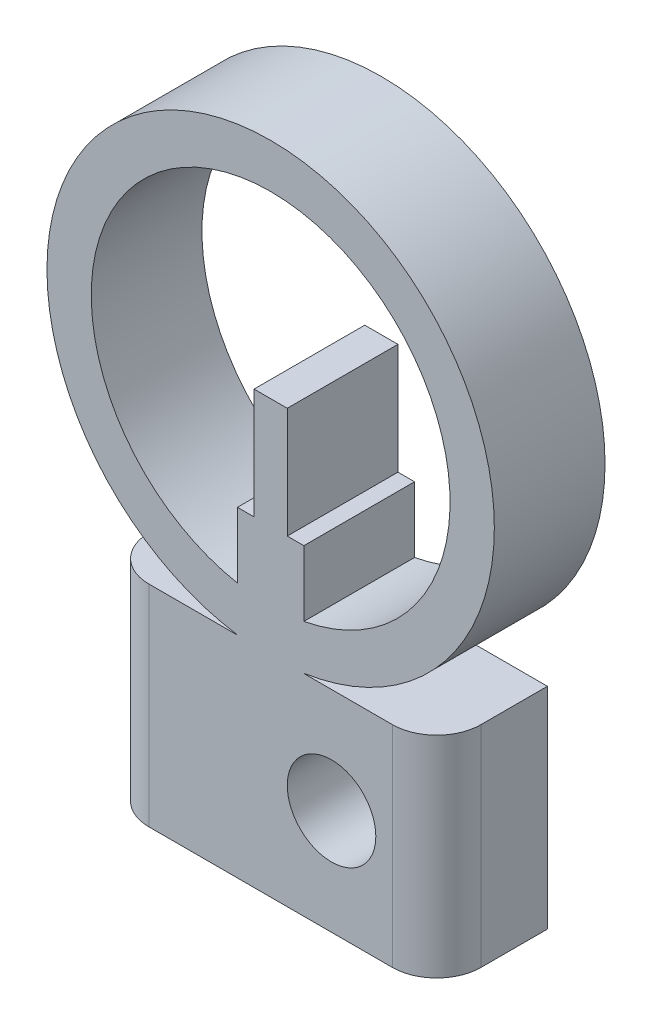
ISO-10303-21;
HEADER;
FILE_DESCRIPTION(('STEP AP214'),'2;1');
FILE_NAME('part.step','',(''),(''),'','','');
FILE_SCHEMA(('AUTOMOTIVE_DESIGN { 1 0 10303 214 1 1 1 1 }'));
ENDSEC;
DATA;
#1=APPLICATION_CONTEXT('core data for automotive mechanical design processes');
#2=APPLICATION_PROTOCOL_DEFINITION('international standard','automotive_design',2000,#1);
#3=PRODUCT_CONTEXT('',#1,'mechanical');
#4=PRODUCT('Part','Part','',(#3));
#5=PRODUCT_RELATED_PRODUCT_CATEGORY('part','',(#4));
#6=PRODUCT_DEFINITION_FORMATION('','',#4);
#7=PRODUCT_DEFINITION_CONTEXT('part definition',#1,'design');
#8=PRODUCT_DEFINITION('design','',#6,#7);
#9=PRODUCT_DEFINITION_SHAPE('','',#8);
#10=(LENGTH_UNIT() NAMED_UNIT(*) SI_UNIT(.MILLI.,.METRE.));
#11=(NAMED_UNIT(*) PLANE_ANGLE_UNIT() SI_UNIT($,.RADIAN.));
#12=(NAMED_UNIT(*) SI_UNIT($,.STERADIAN.) SOLID_ANGLE_UNIT());
#13=UNCERTAINTY_MEASURE_WITH_UNIT(LENGTH_MEASURE(1.E-05),#10,'distance_accuracy_value','');
#14=(GEOMETRIC_REPRESENTATION_CONTEXT(3) GLOBAL_UNCERTAINTY_ASSIGNED_CONTEXT((#13)) GLOBAL_UNIT_ASSIGNED_CONTEXT((#10,
#11,#12)) REPRESENTATION_CONTEXT('',''));
#15=CARTESIAN_POINT('',(0.,0.,0.));
#16=DIRECTION('',(0.,0.,1.));
#17=DIRECTION('',(1.,0.,0.));
#18=AXIS2_PLACEMENT_3D('',#15,#16,#17);
#19=CARTESIAN_POINT('',(-1.5,9.75,-5.));
#20=DIRECTION('',(1.,0.,0.));
#21=DIRECTION('',(0.,1.,0.));
#22=AXIS2_PLACEMENT_3D('',#19,#20,#21);
#23=PLANE('',#22);
#24=DIRECTION('',(0.,0.,1.));
#25=VECTOR('',#24,1.);
#26=CARTESIAN_POINT('',(-1.5,6.78672201259756,-5.));
#27=LINE('',#26,#25);
#28=CARTESIAN_POINT('',(-1.5,6.78672201259756,0.));
#29=VERTEX_POINT('',#28);
#30=CARTESIAN_POINT('',(-1.5,6.78672201259756,-5.));
#31=VERTEX_POINT('',#30);
#32=EDGE_CURVE('E165',#29,#31,#27,.F.);
#33=ORIENTED_EDGE('',*,*,#32,.F.);
#34=DIRECTION('',(0.,-1.,0.));
#35=VECTOR('',#34,1.);
#36=CARTESIAN_POINT('',(-1.5,9.75,0.));
#37=LINE('',#36,#35);
#38=CARTESIAN_POINT('',(-1.5,9.75,0.));
#39=VERTEX_POINT('',#38);
#40=EDGE_CURVE('E270',#39,#29,#37,.T.);
#41=ORIENTED_EDGE('',*,*,#40,.F.);
#42=DIRECTION('',(0.,0.,1.));
#43=VECTOR('',#42,1.);
#44=CARTESIAN_POINT('',(-1.5,9.75,-5.));
#45=LINE('',#44,#43);
#46=CARTESIAN_POINT('',(-1.5,9.75,-5.));
#47=VERTEX_POINT('',#46);
#48=EDGE_CURVE('E168',#47,#39,#45,.T.);
#49=ORIENTED_EDGE('',*,*,#48,.F.);
#50=DIRECTION('',(0.,-1.,0.));
#51=VECTOR('',#50,1.);
#52=CARTESIAN_POINT('',(-1.5,9.75,-5.));
#53=LINE('',#52,#51);
#54=EDGE_CURVE('E162',#47,#31,#53,.T.);
#55=ORIENTED_EDGE('',*,*,#54,.T.);
#56=EDGE_LOOP('',(#33,#41,#49,#55));
#57=FACE_BOUND('',#56,.T.);
#58=ADVANCED_FACE('F39',(#57),#23,.F.);
#59=CARTESIAN_POINT('',(1.5,9.75,-5.));
#60=DIRECTION('',(-1.,0.,0.));
#61=DIRECTION('',(0.,-1.,0.));
#62=AXIS2_PLACEMENT_3D('',#59,#60,#61);
#63=PLANE('',#62);
#64=DIRECTION('',(0.,0.,1.));
#65=VECTOR('',#64,1.);
#66=CARTESIAN_POINT('',(1.5,6.78672201259756,-5.));
#67=LINE('',#66,#65);
#68=CARTESIAN_POINT('',(1.5,6.78672201259756,-5.));
#69=VERTEX_POINT('',#68);
#70=CARTESIAN_POINT('',(1.5,6.78672201259756,0.));
#71=VERTEX_POINT('',#70);
#72=EDGE_CURVE('E48',#69,#71,#67,.T.);
#73=ORIENTED_EDGE('',*,*,#72,.F.);
#74=DIRECTION('',(0.,-1.,0.));
#75=VECTOR('',#74,1.);
#76=CARTESIAN_POINT('',(1.5,9.75,-5.));
#77=LINE('',#76,#75);
#78=CARTESIAN_POINT('',(1.5,9.75,-5.));
#79=VERTEX_POINT('',#78);
#80=EDGE_CURVE('E191',#79,#69,#77,.T.);
#81=ORIENTED_EDGE('',*,*,#80,.F.);
#82=DIRECTION('',(0.,0.,-1.));
#83=VECTOR('',#82,1.);
#84=CARTESIAN_POINT('',(1.5,9.75,-5.));
#85=LINE('',#84,#83);
#86=CARTESIAN_POINT('',(1.5,9.75,0.));
#87=VERTEX_POINT('',#86);
#88=EDGE_CURVE('E251',#87,#79,#85,.T.);
#89=ORIENTED_EDGE('',*,*,#88,.F.);
#90=DIRECTION('',(0.,-1.,0.));
#91=VECTOR('',#90,1.);
#92=CARTESIAN_POINT('',(1.5,9.75,0.));
#93=LINE('',#92,#91);
#94=EDGE_CURVE('E267',#87,#71,#93,.T.);
#95=ORIENTED_EDGE('',*,*,#94,.T.);
#96=EDGE_LOOP('',(#73,#81,#89,#95));
#97=FACE_BOUND('',#96,.T.);
#98=ADVANCED_FACE('F383',(#97),#63,.F.);
#99=CARTESIAN_POINT('',(0.,9.75,0.));
#100=DIRECTION('',(0.,-1.,0.));
#101=DIRECTION('',(0.,0.,-1.));
#102=AXIS2_PLACEMENT_3D('',#99,#100,#101);
#103=PLANE('',#102);
#104=DIRECTION('',(0.,0.,1.));
#105=VECTOR('',#104,1.);
#106=CARTESIAN_POINT('',(-0.750000000000001,9.75,-5.));
#107=LINE('',#106,#105);
#108=CARTESIAN_POINT('',(-0.750000000000001,9.75,-5.));
#109=VERTEX_POINT('',#108);
#110=CARTESIAN_POINT('',(-0.750000000000001,9.75,0.));
#111=VERTEX_POINT('',#110);
#112=EDGE_CURVE('E219',#109,#111,#107,.T.);
#113=ORIENTED_EDGE('',*,*,#112,.F.);
#114=DIRECTION('',(-1.,0.,0.));
#115=VECTOR('',#114,1.);
#116=CARTESIAN_POINT('',(1.5,9.75,-5.));
#117=LINE('',#116,#115);
#118=EDGE_CURVE('E254',#109,#47,#117,.T.);
#119=ORIENTED_EDGE('',*,*,#118,.T.);
#120=ORIENTED_EDGE('',*,*,#48,.T.);
#121=DIRECTION('',(1.,0.,0.));
#122=VECTOR('',#121,1.);
#123=CARTESIAN_POINT('',(1.5,9.75,0.));
#124=LINE('',#123,#122);
#125=EDGE_CURVE('E247',#39,#111,#124,.T.);
#126=ORIENTED_EDGE('',*,*,#125,.T.);
#127=EDGE_LOOP('',(#113,#119,#120,#126));
#128=FACE_BOUND('',#127,.T.);
#129=ADVANCED_FACE('F356',(#128),#103,.F.);
#130=CARTESIAN_POINT('',(7.5,4.75,-5.));
#131=DIRECTION('',(0.,1.,0.));
#132=DIRECTION('',(-1.,0.,0.));
#133=AXIS2_PLACEMENT_3D('',#130,#131,#132);
#134=PLANE('',#133);
#135=DIRECTION('',(0.,0.,1.));
#136=VECTOR('',#135,1.);
#137=CARTESIAN_POINT('',(-7.5,4.75,-5.));
#138=LINE('',#137,#136);
#139=CARTESIAN_POINT('',(-7.5,4.75,-5.));
#140=VERTEX_POINT('',#139);
#141=CARTESIAN_POINT('',(-7.5,4.75,-2.));
#142=VERTEX_POINT('',#141);
#143=EDGE_CURVE('E310',#140,#142,#138,.T.);
#144=ORIENTED_EDGE('',*,*,#143,.T.);
#145=CARTESIAN_POINT('',(-5.5,4.75,-2.));
#146=DIRECTION('',(0.,1.,0.));
#147=DIRECTION('',(-1.,0.,0.));
#148=AXIS2_PLACEMENT_3D('',#145,#146,#147);
#149=CIRCLE('',#148,2.);
#150=CARTESIAN_POINT('',(-5.5,4.75,0.));
#151=VERTEX_POINT('',#150);
#152=EDGE_CURVE('E337',#142,#151,#149,.T.);
#153=ORIENTED_EDGE('',*,*,#152,.T.);
#154=DIRECTION('',(-1.,0.,0.));
#155=VECTOR('',#154,1.);
#156=CARTESIAN_POINT('',(7.5,4.75,0.));
#157=LINE('',#156,#155);
#158=CARTESIAN_POINT('',(-1.5,4.75,0.));
#159=VERTEX_POINT('',#158);
#160=EDGE_CURVE('E299',#159,#151,#157,.T.);
#161=ORIENTED_EDGE('',*,*,#160,.F.);
#162=DIRECTION('',(0.,0.,1.));
#163=VECTOR('',#162,1.);
#164=CARTESIAN_POINT('',(-1.5,4.75,-5.));
#165=LINE('',#164,#163);
#166=CARTESIAN_POINT('',(-1.5,4.75,-5.));
#167=VERTEX_POINT('',#166);
#168=EDGE_CURVE('E242',#167,#159,#165,.T.);
#169=ORIENTED_EDGE('',*,*,#168,.F.);
#170=DIRECTION('',(-1.,0.,0.));
#171=VECTOR('',#170,1.);
#172=CARTESIAN_POINT('',(7.5,4.75,-5.));
#173=LINE('',#172,#171);
#174=EDGE_CURVE('E286',#167,#140,#173,.T.);
#175=ORIENTED_EDGE('',*,*,#174,.T.);
#176=EDGE_LOOP('',(#144,#153,#161,#169,#175));
#177=FACE_BOUND('',#176,.T.);
#178=ADVANCED_FACE('F419',(#177),#134,.T.);
#179=CARTESIAN_POINT('',(7.5,-4.75,-5.));
#180=DIRECTION('',(0.,1.,0.));
#181=DIRECTION('',(-1.,0.,0.));
#182=AXIS2_PLACEMENT_3D('',#179,#180,#181);
#183=PLANE('',#182);
#184=DIRECTION('',(-1.,0.,0.));
#185=VECTOR('',#184,1.);
#186=CARTESIAN_POINT('',(7.5,-4.75,0.));
#187=LINE('',#186,#185);
#188=CARTESIAN_POINT('',(5.5,-4.75,0.));
#189=VERTEX_POINT('',#188);
#190=CARTESIAN_POINT('',(-5.5,-4.75,0.));
#191=VERTEX_POINT('',#190);
#192=EDGE_CURVE('E295',#189,#191,#187,.T.);
#193=ORIENTED_EDGE('',*,*,#192,.T.);
#194=CARTESIAN_POINT('',(-5.5,-4.75,-2.));
#195=DIRECTION('',(0.,1.,0.));
#196=DIRECTION('',(-1.,0.,0.));
#197=AXIS2_PLACEMENT_3D('',#194,#195,#196);
#198=CIRCLE('',#197,2.);
#199=CARTESIAN_POINT('',(-7.5,-4.75,-2.));
#200=VERTEX_POINT('',#199);
#201=EDGE_CURVE('E331',#191,#200,#198,.F.);
#202=ORIENTED_EDGE('',*,*,#201,.T.);
#203=DIRECTION('',(0.,0.,1.));
#204=VECTOR('',#203,1.);
#205=CARTESIAN_POINT('',(-7.5,-4.75,-5.));
#206=LINE('',#205,#204);
#207=CARTESIAN_POINT('',(-7.5,-4.75,-5.));
#208=VERTEX_POINT('',#207);
#209=EDGE_CURVE('E314',#208,#200,#206,.T.);
#210=ORIENTED_EDGE('',*,*,#209,.F.);
#211=DIRECTION('',(-1.,0.,0.));
#212=VECTOR('',#211,1.);
#213=CARTESIAN_POINT('',(7.5,-4.75,-5.));
#214=LINE('',#213,#212);
#215=CARTESIAN_POINT('',(7.5,-4.75,-5.));
#216=VERTEX_POINT('',#215);
#217=EDGE_CURVE('E278',#216,#208,#214,.T.);
#218=ORIENTED_EDGE('',*,*,#217,.F.);
#219=DIRECTION('',(0.,0.,1.));
#220=VECTOR('',#219,1.);
#221=CARTESIAN_POINT('',(7.5,-4.75,-5.));
#222=LINE('',#221,#220);
#223=CARTESIAN_POINT('',(7.5,-4.75,-2.));
#224=VERTEX_POINT('',#223);
#225=EDGE_CURVE('E294',#216,#224,#222,.T.);
#226=ORIENTED_EDGE('',*,*,#225,.T.);
#227=CARTESIAN_POINT('',(5.5,-4.75,-2.));
#228=DIRECTION('',(0.,1.,0.));
#229=DIRECTION('',(-1.,0.,0.));
#230=AXIS2_PLACEMENT_3D('',#227,#228,#229);
#231=CIRCLE('',#230,2.);
#232=EDGE_CURVE('E328',#224,#189,#231,.F.);
#233=ORIENTED_EDGE('',*,*,#232,.T.);
#234=EDGE_LOOP('',(#193,#202,#210,#218,#226,#233));
#235=FACE_BOUND('',#234,.T.);
#236=ADVANCED_FACE('F422',(#235),#183,.F.);
#237=CARTESIAN_POINT('',(-7.5,4.75,-5.));
#238=DIRECTION('',(-1.,0.,0.));
#239=DIRECTION('',(0.,-1.,0.));
#240=AXIS2_PLACEMENT_3D('',#237,#238,#239);
#241=PLANE('',#240);
#242=ORIENTED_EDGE('',*,*,#209,.T.);
#243=DIRECTION('',(0.,-1.,0.));
#244=VECTOR('',#243,1.);
#245=CARTESIAN_POINT('',(-7.5,4.75,-2.));
#246=LINE('',#245,#244);
#247=EDGE_CURVE('E334',#200,#142,#246,.F.);
#248=ORIENTED_EDGE('',*,*,#247,.T.);
#249=ORIENTED_EDGE('',*,*,#143,.F.);
#250=DIRECTION('',(0.,-1.,0.));
#251=VECTOR('',#250,1.);
#252=CARTESIAN_POINT('',(-7.5,4.75,-5.));
#253=LINE('',#252,#251);
#254=EDGE_CURVE('E281',#140,#208,#253,.T.);
#255=ORIENTED_EDGE('',*,*,#254,.T.);
#256=EDGE_LOOP('',(#242,#248,#249,#255));
#257=FACE_BOUND('',#256,.T.);
#258=ADVANCED_FACE('F417',(#257),#241,.T.);
#259=CARTESIAN_POINT('',(5.5,4.75,0.));
#260=VERTEX_POINT('',#259);
#261=CARTESIAN_POINT('',(1.5,4.75,0.));
#262=VERTEX_POINT('',#261);
#263=EDGE_CURVE('E282',#260,#262,#157,.T.);
#264=ORIENTED_EDGE('',*,*,#263,.F.);
#265=CARTESIAN_POINT('',(5.5,4.75,-2.));
#266=DIRECTION('',(0.,1.,0.));
#267=DIRECTION('',(-1.,0.,0.));
#268=AXIS2_PLACEMENT_3D('',#265,#266,#267);
#269=CIRCLE('',#268,2.);
#270=CARTESIAN_POINT('',(7.5,4.75,-2.));
#271=VERTEX_POINT('',#270);
#272=EDGE_CURVE('E344',#260,#271,#269,.T.);
#273=ORIENTED_EDGE('',*,*,#272,.T.);
#274=DIRECTION('',(0.,0.,1.));
#275=VECTOR('',#274,1.);
#276=CARTESIAN_POINT('',(7.5,4.75,-5.));
#277=LINE('',#276,#275);
#278=CARTESIAN_POINT('',(7.5,4.75,-5.));
#279=VERTEX_POINT('',#278);
#280=EDGE_CURVE('E306',#279,#271,#277,.T.);
#281=ORIENTED_EDGE('',*,*,#280,.F.);
#282=CARTESIAN_POINT('',(1.5,4.75,-5.));
#283=VERTEX_POINT('',#282);
#284=EDGE_CURVE('E287',#279,#283,#173,.T.);
#285=ORIENTED_EDGE('',*,*,#284,.T.);
#286=DIRECTION('',(0.,0.,-1.));
#287=VECTOR('',#286,1.);
#288=CARTESIAN_POINT('',(1.5,4.75,-5.));
#289=LINE('',#288,#287);
#290=EDGE_CURVE('E246',#262,#283,#289,.T.);
#291=ORIENTED_EDGE('',*,*,#290,.F.);
#292=EDGE_LOOP('',(#264,#273,#281,#285,#291));
#293=FACE_BOUND('',#292,.T.);
#294=ADVANCED_FACE('F413',(#293),#134,.T.);
#295=CARTESIAN_POINT('',(7.5,4.75,-5.));
#296=DIRECTION('',(-1.,0.,0.));
#297=DIRECTION('',(0.,0.,1.));
#298=AXIS2_PLACEMENT_3D('',#295,#296,#297);
#299=PLANE('',#298);
#300=ORIENTED_EDGE('',*,*,#280,.T.);
#301=DIRECTION('',(0.,-1.,0.));
#302=VECTOR('',#301,1.);
#303=CARTESIAN_POINT('',(7.5,-4.75,-2.));
#304=LINE('',#303,#302);
#305=EDGE_CURVE('E340',#271,#224,#304,.T.);
#306=ORIENTED_EDGE('',*,*,#305,.T.);
#307=ORIENTED_EDGE('',*,*,#225,.F.);
#308=DIRECTION('',(0.,-1.,0.));
#309=VECTOR('',#308,1.);
#310=CARTESIAN_POINT('',(7.5,4.75,-5.));
#311=LINE('',#310,#309);
#312=EDGE_CURVE('E291',#279,#216,#311,.T.);
#313=ORIENTED_EDGE('',*,*,#312,.F.);
#314=EDGE_LOOP('',(#300,#306,#307,#313));
#315=FACE_BOUND('',#314,.T.);
#316=ADVANCED_FACE('F408',(#315),#299,.F.);
#317=CARTESIAN_POINT('',(0.,0.,-5.));
#318=DIRECTION('',(0.,0.,1.));
#319=DIRECTION('',(1.,0.,0.));
#320=AXIS2_PLACEMENT_3D('',#317,#318,#319);
#321=PLANE('',#320);
#322=CARTESIAN_POINT('',(2.75,0.,-5.));
#323=DIRECTION('',(0.,0.,1.));
#324=DIRECTION('',(1.,0.,0.));
#325=AXIS2_PLACEMENT_3D('',#322,#323,#324);
#326=CIRCLE('',#325,2.);
#327=CARTESIAN_POINT('',(4.75,0.,-5.));
#328=VERTEX_POINT('',#327);
#329=EDGE_CURVE('E273',#328,#328,#326,.T.);
#330=ORIENTED_EDGE('',*,*,#329,.T.);
#331=EDGE_LOOP('',(#330));
#332=FACE_BOUND('',#331,.T.);
#333=CARTESIAN_POINT('',(-1.5,4.75864990999099,-5.));
#334=VERTEX_POINT('',#333);
#335=EDGE_CURVE('E174',#334,#167,#53,.T.);
#336=ORIENTED_EDGE('',*,*,#335,.F.);
#337=CARTESIAN_POINT('',(0.,14.75,-5.));
#338=DIRECTION('',(0.,0.,1.));
#339=DIRECTION('',(1.,0.,0.));
#340=AXIS2_PLACEMENT_3D('',#337,#338,#339);
#341=CIRCLE('',#340,10.1033200791187);
#342=CARTESIAN_POINT('',(1.5,4.75864990999099,-5.));
#343=VERTEX_POINT('',#342);
#344=EDGE_CURVE('E185',#343,#334,#341,.T.);
#345=ORIENTED_EDGE('',*,*,#344,.F.);
#346=EDGE_CURVE('E173',#343,#283,#77,.T.);
#347=ORIENTED_EDGE('',*,*,#346,.T.);
#348=ORIENTED_EDGE('',*,*,#284,.F.);
#349=ORIENTED_EDGE('',*,*,#312,.T.);
#350=ORIENTED_EDGE('',*,*,#217,.T.);
#351=ORIENTED_EDGE('',*,*,#254,.F.);
#352=ORIENTED_EDGE('',*,*,#174,.F.);
#353=EDGE_LOOP('',(#336,#345,#347,#348,#349,#350,#351,#352));
#354=FACE_BOUND('',#353,.T.);
#355=ORIENTED_EDGE('',*,*,#80,.T.);
#356=CARTESIAN_POINT('',(0.,14.75,-5.));
#357=DIRECTION('',(0.,0.,1.));
#358=DIRECTION('',(1.,0.,0.));
#359=AXIS2_PLACEMENT_3D('',#356,#357,#358);
#360=CIRCLE('',#359,8.1033200791187);
#361=EDGE_CURVE('E181',#69,#31,#360,.T.);
#362=ORIENTED_EDGE('',*,*,#361,.T.);
#363=ORIENTED_EDGE('',*,*,#54,.F.);
#364=ORIENTED_EDGE('',*,*,#118,.F.);
#365=DIRECTION('',(0.,1.,0.));
#366=VECTOR('',#365,1.);
#367=CARTESIAN_POINT('',(-0.750000000000001,9.75,-5.));
#368=LINE('',#367,#366);
#369=CARTESIAN_POINT('',(-0.750000000000001,14.75,-5.));
#370=VERTEX_POINT('',#369);
#371=EDGE_CURVE('E207',#109,#370,#368,.T.);
#372=ORIENTED_EDGE('',*,*,#371,.T.);
#373=DIRECTION('',(-1.,0.,0.));
#374=VECTOR('',#373,1.);
#375=CARTESIAN_POINT('',(0.749999999999999,14.75,-5.));
#376=LINE('',#375,#374);
#377=CARTESIAN_POINT('',(0.749999999999999,14.75,-5.));
#378=VERTEX_POINT('',#377);
#379=EDGE_CURVE('E210',#378,#370,#376,.T.);
#380=ORIENTED_EDGE('',*,*,#379,.F.);
#381=DIRECTION('',(0.,1.,0.));
#382=VECTOR('',#381,1.);
#383=CARTESIAN_POINT('',(0.749999999999999,9.75,-5.));
#384=LINE('',#383,#382);
#385=CARTESIAN_POINT('',(0.749999999999999,9.75,-5.));
#386=VERTEX_POINT('',#385);
#387=EDGE_CURVE('E215',#386,#378,#384,.T.);
#388=ORIENTED_EDGE('',*,*,#387,.F.);
#389=EDGE_CURVE('E255',#79,#386,#117,.T.);
#390=ORIENTED_EDGE('',*,*,#389,.F.);
#391=EDGE_LOOP('',(#355,#362,#363,#364,#372,#380,#388,#390));
#392=FACE_BOUND('',#391,.T.);
#393=ADVANCED_FACE('F188',(#332,#354,#392),#321,.F.);
#394=CARTESIAN_POINT('',(0.,0.,0.));
#395=DIRECTION('',(0.,0.,1.));
#396=DIRECTION('',(1.,0.,0.));
#397=AXIS2_PLACEMENT_3D('',#394,#395,#396);
#398=PLANE('',#397);
#399=CARTESIAN_POINT('',(1.5,4.75864990999099,0.));
#400=VERTEX_POINT('',#399);
#401=EDGE_CURVE('E266',#400,#262,#93,.T.);
#402=ORIENTED_EDGE('',*,*,#401,.F.);
#403=CARTESIAN_POINT('',(0.,14.75,0.));
#404=DIRECTION('',(0.,0.,1.));
#405=DIRECTION('',(1.,0.,0.));
#406=AXIS2_PLACEMENT_3D('',#403,#404,#405);
#407=CIRCLE('',#406,10.1033200791187);
#408=CARTESIAN_POINT('',(-1.5,4.75864990999099,0.));
#409=VERTEX_POINT('',#408);
#410=EDGE_CURVE('E193',#400,#409,#407,.T.);
#411=ORIENTED_EDGE('',*,*,#410,.T.);
#412=EDGE_CURVE('E60',#409,#159,#37,.T.);
#413=ORIENTED_EDGE('',*,*,#412,.T.);
#414=ORIENTED_EDGE('',*,*,#160,.T.);
#415=DIRECTION('',(0.,-1.,0.));
#416=VECTOR('',#415,1.);
#417=CARTESIAN_POINT('',(-5.5,0.,0.));
#418=LINE('',#417,#416);
#419=EDGE_CURVE('E324',#151,#191,#418,.T.);
#420=ORIENTED_EDGE('',*,*,#419,.T.);
#421=ORIENTED_EDGE('',*,*,#192,.F.);
#422=DIRECTION('',(0.,-1.,0.));
#423=VECTOR('',#422,1.);
#424=CARTESIAN_POINT('',(5.5,4.75,0.));
#425=LINE('',#424,#423);
#426=EDGE_CURVE('E318',#189,#260,#425,.F.);
#427=ORIENTED_EDGE('',*,*,#426,.T.);
#428=ORIENTED_EDGE('',*,*,#263,.T.);
#429=EDGE_LOOP('',(#402,#411,#413,#414,#420,#421,#427,#428));
#430=FACE_BOUND('',#429,.T.);
#431=CARTESIAN_POINT('',(2.75,0.,0.));
#432=DIRECTION('',(0.,0.,1.));
#433=DIRECTION('',(1.,0.,0.));
#434=AXIS2_PLACEMENT_3D('',#431,#432,#433);
#435=CIRCLE('',#434,2.);
#436=CARTESIAN_POINT('',(4.75,0.,0.));
#437=VERTEX_POINT('',#436);
#438=EDGE_CURVE('E277',#437,#437,#435,.T.);
#439=ORIENTED_EDGE('',*,*,#438,.F.);
#440=EDGE_LOOP('',(#439));
#441=FACE_BOUND('',#440,.T.);
#442=ORIENTED_EDGE('',*,*,#40,.T.);
#443=CARTESIAN_POINT('',(0.,14.75,0.));
#444=DIRECTION('',(0.,0.,1.));
#445=DIRECTION('',(1.,0.,0.));
#446=AXIS2_PLACEMENT_3D('',#443,#444,#445);
#447=CIRCLE('',#446,8.1033200791187);
#448=EDGE_CURVE('E183',#71,#29,#447,.T.);
#449=ORIENTED_EDGE('',*,*,#448,.F.);
#450=ORIENTED_EDGE('',*,*,#94,.F.);
#451=CARTESIAN_POINT('',(0.749999999999999,9.75,0.));
#452=VERTEX_POINT('',#451);
#453=EDGE_CURVE('E245',#452,#87,#124,.T.);
#454=ORIENTED_EDGE('',*,*,#453,.F.);
#455=DIRECTION('',(0.,1.,0.));
#456=VECTOR('',#455,1.);
#457=CARTESIAN_POINT('',(0.749999999999999,9.75,0.));
#458=LINE('',#457,#456);
#459=CARTESIAN_POINT('',(0.749999999999999,14.75,0.));
#460=VERTEX_POINT('',#459);
#461=EDGE_CURVE('E211',#452,#460,#458,.T.);
#462=ORIENTED_EDGE('',*,*,#461,.T.);
#463=DIRECTION('',(-1.,0.,0.));
#464=VECTOR('',#463,1.);
#465=CARTESIAN_POINT('',(0.749999999999999,14.75,0.));
#466=LINE('',#465,#464);
#467=CARTESIAN_POINT('',(-0.750000000000001,14.75,0.));
#468=VERTEX_POINT('',#467);
#469=EDGE_CURVE('E223',#460,#468,#466,.T.);
#470=ORIENTED_EDGE('',*,*,#469,.T.);
#471=DIRECTION('',(0.,1.,0.));
#472=VECTOR('',#471,1.);
#473=CARTESIAN_POINT('',(-0.750000000000001,9.75,0.));
#474=LINE('',#473,#472);
#475=EDGE_CURVE('E206',#111,#468,#474,.T.);
#476=ORIENTED_EDGE('',*,*,#475,.F.);
#477=ORIENTED_EDGE('',*,*,#125,.F.);
#478=EDGE_LOOP('',(#442,#449,#450,#454,#462,#470,#476,#477));
#479=FACE_BOUND('',#478,.T.);
#480=ADVANCED_FACE('F350',(#430,#441,#479),#398,.T.);
#481=CARTESIAN_POINT('',(2.75,0.,-5.));
#482=DIRECTION('',(0.,0.,1.));
#483=DIRECTION('',(1.,0.,0.));
#484=AXIS2_PLACEMENT_3D('',#481,#482,#483);
#485=CYLINDRICAL_SURFACE('',#484,2.);
#486=ORIENTED_EDGE('',*,*,#438,.T.);
#487=EDGE_LOOP('',(#486));
#488=FACE_BOUND('',#487,.T.);
#489=ORIENTED_EDGE('',*,*,#329,.F.);
#490=EDGE_LOOP('',(#489));
#491=FACE_BOUND('',#490,.T.);
#492=ADVANCED_FACE('F393',(#488,#491),#485,.F.);
#493=ORIENTED_EDGE('',*,*,#412,.F.);
#494=DIRECTION('',(0.,0.,1.));
#495=VECTOR('',#494,1.);
#496=CARTESIAN_POINT('',(-1.5,4.75864990999099,-5.));
#497=LINE('',#496,#495);
#498=EDGE_CURVE('E55',#409,#334,#497,.F.);
#499=ORIENTED_EDGE('',*,*,#498,.T.);
#500=ORIENTED_EDGE('',*,*,#335,.T.);
#501=ORIENTED_EDGE('',*,*,#168,.T.);
#502=EDGE_LOOP('',(#493,#499,#500,#501));
#503=FACE_BOUND('',#502,.T.);
#504=ADVANCED_FACE('F385',(#503),#23,.F.);
#505=ORIENTED_EDGE('',*,*,#346,.F.);
#506=DIRECTION('',(0.,0.,1.));
#507=VECTOR('',#506,1.);
#508=CARTESIAN_POINT('',(1.5,4.75864990999099,-5.));
#509=LINE('',#508,#507);
#510=EDGE_CURVE('E11',#343,#400,#509,.T.);
#511=ORIENTED_EDGE('',*,*,#510,.T.);
#512=ORIENTED_EDGE('',*,*,#401,.T.);
#513=ORIENTED_EDGE('',*,*,#290,.T.);
#514=EDGE_LOOP('',(#505,#511,#512,#513));
#515=FACE_BOUND('',#514,.T.);
#516=ADVANCED_FACE('F390',(#515),#63,.F.);
#517=ORIENTED_EDGE('',*,*,#389,.T.);
#518=DIRECTION('',(0.,0.,1.));
#519=VECTOR('',#518,1.);
#520=CARTESIAN_POINT('',(0.749999999999999,9.75,-5.));
#521=LINE('',#520,#519);
#522=EDGE_CURVE('E232',#386,#452,#521,.T.);
#523=ORIENTED_EDGE('',*,*,#522,.T.);
#524=ORIENTED_EDGE('',*,*,#453,.T.);
#525=ORIENTED_EDGE('',*,*,#88,.T.);
#526=EDGE_LOOP('',(#517,#523,#524,#525));
#527=FACE_BOUND('',#526,.T.);
#528=ADVANCED_FACE('F361',(#527),#103,.F.);
#529=CARTESIAN_POINT('',(-5.5,0.,-2.));
#530=DIRECTION('',(0.,-1.,0.));
#531=DIRECTION('',(1.,0.,0.));
#532=AXIS2_PLACEMENT_3D('',#529,#530,#531);
#533=CYLINDRICAL_SURFACE('',#532,2.);
#534=ORIENTED_EDGE('',*,*,#152,.F.);
#535=ORIENTED_EDGE('',*,*,#247,.F.);
#536=ORIENTED_EDGE('',*,*,#201,.F.);
#537=ORIENTED_EDGE('',*,*,#419,.F.);
#538=EDGE_LOOP('',(#534,#535,#536,#537));
#539=FACE_BOUND('',#538,.T.);
#540=ADVANCED_FACE('F379',(#539),#533,.T.);
#541=CARTESIAN_POINT('',(5.5,4.75,-2.));
#542=DIRECTION('',(0.,1.,0.));
#543=DIRECTION('',(0.,0.,1.));
#544=AXIS2_PLACEMENT_3D('',#541,#542,#543);
#545=CYLINDRICAL_SURFACE('',#544,2.);
#546=ORIENTED_EDGE('',*,*,#272,.F.);
#547=ORIENTED_EDGE('',*,*,#426,.F.);
#548=ORIENTED_EDGE('',*,*,#232,.F.);
#549=ORIENTED_EDGE('',*,*,#305,.F.);
#550=EDGE_LOOP('',(#546,#547,#548,#549));
#551=FACE_BOUND('',#550,.T.);
#552=ADVANCED_FACE('F41',(#551),#545,.T.);
#553=CARTESIAN_POINT('',(-0.750000000000001,9.75,-5.));
#554=DIRECTION('',(1.,0.,0.));
#555=DIRECTION('',(0.,0.,-1.));
#556=AXIS2_PLACEMENT_3D('',#553,#554,#555);
#557=PLANE('',#556);
#558=ORIENTED_EDGE('',*,*,#475,.T.);
#559=DIRECTION('',(0.,0.,1.));
#560=VECTOR('',#559,1.);
#561=CARTESIAN_POINT('',(-0.750000000000001,14.75,-5.));
#562=LINE('',#561,#560);
#563=EDGE_CURVE('E239',#370,#468,#562,.T.);
#564=ORIENTED_EDGE('',*,*,#563,.F.);
#565=ORIENTED_EDGE('',*,*,#371,.F.);
#566=ORIENTED_EDGE('',*,*,#112,.T.);
#567=EDGE_LOOP('',(#558,#564,#565,#566));
#568=FACE_BOUND('',#567,.T.);
#569=ADVANCED_FACE('F371',(#568),#557,.F.);
#570=CARTESIAN_POINT('',(0.749999999999999,14.75,-5.));
#571=DIRECTION('',(0.,1.,0.));
#572=DIRECTION('',(0.,0.,1.));
#573=AXIS2_PLACEMENT_3D('',#570,#571,#572);
#574=PLANE('',#573);
#575=ORIENTED_EDGE('',*,*,#469,.F.);
#576=DIRECTION('',(0.,0.,1.));
#577=VECTOR('',#576,1.);
#578=CARTESIAN_POINT('',(0.749999999999999,14.75,-5.));
#579=LINE('',#578,#577);
#580=EDGE_CURVE('E236',#378,#460,#579,.T.);
#581=ORIENTED_EDGE('',*,*,#580,.F.);
#582=ORIENTED_EDGE('',*,*,#379,.T.);
#583=ORIENTED_EDGE('',*,*,#563,.T.);
#584=EDGE_LOOP('',(#575,#581,#582,#583));
#585=FACE_BOUND('',#584,.T.);
#586=ADVANCED_FACE('F368',(#585),#574,.T.);
#587=CARTESIAN_POINT('',(0.749999999999999,9.75,-5.));
#588=DIRECTION('',(1.,0.,0.));
#589=DIRECTION('',(0.,0.,-1.));
#590=AXIS2_PLACEMENT_3D('',#587,#588,#589);
#591=PLANE('',#590);
#592=ORIENTED_EDGE('',*,*,#461,.F.);
#593=ORIENTED_EDGE('',*,*,#522,.F.);
#594=ORIENTED_EDGE('',*,*,#387,.T.);
#595=ORIENTED_EDGE('',*,*,#580,.T.);
#596=EDGE_LOOP('',(#592,#593,#594,#595));
#597=FACE_BOUND('',#596,.T.);
#598=ADVANCED_FACE('F364',(#597),#591,.T.);
#599=CARTESIAN_POINT('',(0.,14.75,-5.));
#600=DIRECTION('',(0.,0.,1.));
#601=DIRECTION('',(1.,0.,0.));
#602=AXIS2_PLACEMENT_3D('',#599,#600,#601);
#603=CYLINDRICAL_SURFACE('',#602,10.1033200791187);
#604=ORIENTED_EDGE('',*,*,#498,.F.);
#605=ORIENTED_EDGE('',*,*,#410,.F.);
#606=ORIENTED_EDGE('',*,*,#510,.F.);
#607=ORIENTED_EDGE('',*,*,#344,.T.);
#608=EDGE_LOOP('',(#604,#605,#606,#607));
#609=FACE_BOUND('',#608,.T.);
#610=ADVANCED_FACE('F464',(#609),#603,.T.);
#611=CARTESIAN_POINT('',(0.,14.75,-5.));
#612=DIRECTION('',(0.,0.,1.));
#613=DIRECTION('',(1.,0.,0.));
#614=AXIS2_PLACEMENT_3D('',#611,#612,#613);
#615=CYLINDRICAL_SURFACE('',#614,8.1033200791187);
#616=ORIENTED_EDGE('',*,*,#448,.T.);
#617=ORIENTED_EDGE('',*,*,#32,.T.);
#618=ORIENTED_EDGE('',*,*,#361,.F.);
#619=ORIENTED_EDGE('',*,*,#72,.T.);
#620=EDGE_LOOP('',(#616,#617,#618,#619));
#621=FACE_BOUND('',#620,.T.);
#622=ADVANCED_FACE('F179',(#621),#615,.F.);
#623=CLOSED_SHELL('',(#58,#98,#129,#178,#236,#258,#294,#316,#393,#480,#492,#504,#516,#528,#540,
#552,#569,#586,#598,#610,#622));
#624=MANIFOLD_SOLID_BREP('B2',#623);
#625=ADVANCED_BREP_SHAPE_REPRESENTATION('',(#18,#624),#14);
#626=SHAPE_DEFINITION_REPRESENTATION(#9,#625);
ENDSEC;
END-ISO-10303-21;
